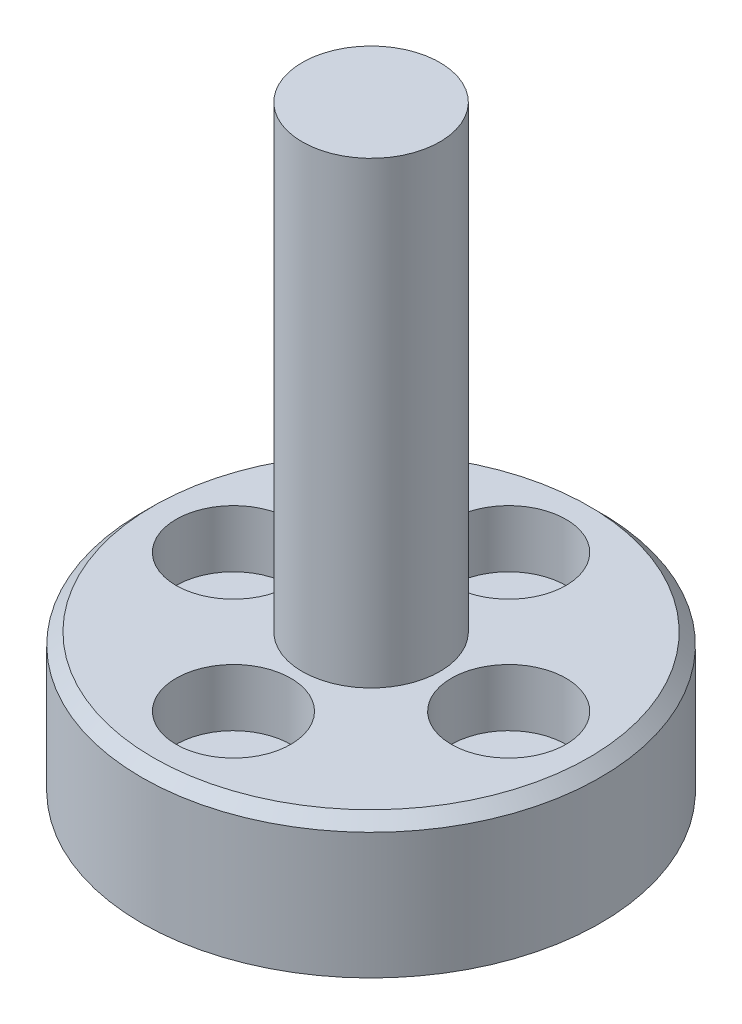
ISO-10303-21;
HEADER;
FILE_DESCRIPTION(('STEP AP214'),'2;1');
FILE_NAME('part.step','',(''),(''),'','','');
FILE_SCHEMA(('AUTOMOTIVE_DESIGN { 1 0 10303 214 1 1 1 1 }'));
ENDSEC;
DATA;
#1=APPLICATION_CONTEXT('core data for automotive mechanical design processes');
#2=APPLICATION_PROTOCOL_DEFINITION('international standard','automotive_design',2000,#1);
#3=PRODUCT_CONTEXT('',#1,'mechanical');
#4=PRODUCT('Part','Part','',(#3));
#5=PRODUCT_RELATED_PRODUCT_CATEGORY('part','',(#4));
#6=PRODUCT_DEFINITION_FORMATION('','',#4);
#7=PRODUCT_DEFINITION_CONTEXT('part definition',#1,'design');
#8=PRODUCT_DEFINITION('design','',#6,#7);
#9=PRODUCT_DEFINITION_SHAPE('','',#8);
#10=(LENGTH_UNIT() NAMED_UNIT(*) SI_UNIT(.MILLI.,.METRE.));
#11=(NAMED_UNIT(*) PLANE_ANGLE_UNIT() SI_UNIT($,.RADIAN.));
#12=(NAMED_UNIT(*) SI_UNIT($,.STERADIAN.) SOLID_ANGLE_UNIT());
#13=UNCERTAINTY_MEASURE_WITH_UNIT(LENGTH_MEASURE(1.E-05),#10,'distance_accuracy_value','');
#14=(GEOMETRIC_REPRESENTATION_CONTEXT(3) GLOBAL_UNCERTAINTY_ASSIGNED_CONTEXT((#13)) GLOBAL_UNIT_ASSIGNED_CONTEXT((#10,
#11,#12)) REPRESENTATION_CONTEXT('',''));
#15=CARTESIAN_POINT('',(0.,0.,0.));
#16=DIRECTION('',(0.,0.,1.));
#17=DIRECTION('',(1.,0.,0.));
#18=AXIS2_PLACEMENT_3D('',#15,#16,#17);
#19=CARTESIAN_POINT('',(-5.99999999999983,-4.,1.7016286254268E-13));
#20=DIRECTION('',(0.,1.,0.));
#21=DIRECTION('',(0.,0.,1.));
#22=AXIS2_PLACEMENT_3D('',#19,#20,#21);
#23=CYLINDRICAL_SURFACE('',#22,1.00000000000027);
#24=CARTESIAN_POINT('',(-5.99999999999983,0.,1.7016286254268E-13));
#25=DIRECTION('',(0.,1.,0.));
#26=DIRECTION('',(0.,0.,1.));
#27=AXIS2_PLACEMENT_3D('',#24,#25,#26);
#28=CIRCLE('',#27,1.00000000000027);
#29=CARTESIAN_POINT('',(-5.99999999999983,0.,1.00000000000044));
#30=VERTEX_POINT('',#29);
#31=EDGE_CURVE('E56',#30,#30,#28,.T.);
#32=ORIENTED_EDGE('',*,*,#31,.F.);
#33=EDGE_LOOP('',(#32));
#34=FACE_BOUND('',#33,.T.);
#35=CARTESIAN_POINT('',(-5.99999999999983,3.5,1.7016286254268E-13));
#36=DIRECTION('',(0.,1.,0.));
#37=DIRECTION('',(0.,0.,1.));
#38=AXIS2_PLACEMENT_3D('',#35,#36,#37);
#39=CIRCLE('',#38,1.00000000000027);
#40=CARTESIAN_POINT('',(-5.99999999999983,3.5,1.00000000000044));
#41=VERTEX_POINT('',#40);
#42=EDGE_CURVE('E41',#41,#41,#39,.F.);
#43=ORIENTED_EDGE('',*,*,#42,.F.);
#44=EDGE_LOOP('',(#43));
#45=FACE_BOUND('',#44,.T.);
#46=ADVANCED_FACE('F37',(#34,#45),#23,.F.);
#47=CARTESIAN_POINT('',(3.38856148926383E-13,-4.,6.));
#48=DIRECTION('',(0.,1.,0.));
#49=DIRECTION('',(0.,0.,1.));
#50=AXIS2_PLACEMENT_3D('',#47,#48,#49);
#51=CYLINDRICAL_SURFACE('',#50,1.00000000000036);
#52=CARTESIAN_POINT('',(3.38856148926383E-13,0.,6.));
#53=DIRECTION('',(0.,1.,0.));
#54=DIRECTION('',(0.,0.,1.));
#55=AXIS2_PLACEMENT_3D('',#52,#53,#54);
#56=CIRCLE('',#55,1.00000000000036);
#57=CARTESIAN_POINT('',(3.38856148926383E-13,0.,7.00000000000036));
#58=VERTEX_POINT('',#57);
#59=EDGE_CURVE('E60',#58,#58,#56,.T.);
#60=ORIENTED_EDGE('',*,*,#59,.F.);
#61=EDGE_LOOP('',(#60));
#62=FACE_BOUND('',#61,.T.);
#63=CARTESIAN_POINT('',(3.38856148926383E-13,3.5,6.));
#64=DIRECTION('',(0.,1.,0.));
#65=DIRECTION('',(0.,0.,1.));
#66=AXIS2_PLACEMENT_3D('',#63,#64,#65);
#67=CIRCLE('',#66,1.00000000000036);
#68=CARTESIAN_POINT('',(3.38856148926383E-13,3.5,7.00000000000036));
#69=VERTEX_POINT('',#68);
#70=EDGE_CURVE('E81',#69,#69,#67,.F.);
#71=ORIENTED_EDGE('',*,*,#70,.F.);
#72=EDGE_LOOP('',(#71));
#73=FACE_BOUND('',#72,.T.);
#74=ADVANCED_FACE('F93',(#62,#73),#51,.F.);
#75=CARTESIAN_POINT('',(6.00000000000017,-4.,-1.69428074463191E-13));
#76=DIRECTION('',(0.,1.,0.));
#77=DIRECTION('',(0.,0.,1.));
#78=AXIS2_PLACEMENT_3D('',#75,#76,#77);
#79=CYLINDRICAL_SURFACE('',#78,1.00000000000013);
#80=CARTESIAN_POINT('',(6.00000000000017,0.,-1.69428074463191E-13));
#81=DIRECTION('',(0.,1.,0.));
#82=DIRECTION('',(0.,0.,1.));
#83=AXIS2_PLACEMENT_3D('',#80,#81,#82);
#84=CIRCLE('',#83,1.00000000000013);
#85=CARTESIAN_POINT('',(6.00000000000017,0.,0.999999999999963));
#86=VERTEX_POINT('',#85);
#87=EDGE_CURVE('E64',#86,#86,#84,.T.);
#88=ORIENTED_EDGE('',*,*,#87,.F.);
#89=EDGE_LOOP('',(#88));
#90=FACE_BOUND('',#89,.T.);
#91=CARTESIAN_POINT('',(6.00000000000017,3.5,-1.69428074463191E-13));
#92=DIRECTION('',(0.,1.,0.));
#93=DIRECTION('',(0.,0.,1.));
#94=AXIS2_PLACEMENT_3D('',#91,#92,#93);
#95=CIRCLE('',#94,1.00000000000013);
#96=CARTESIAN_POINT('',(6.00000000000017,3.5,0.999999999999963));
#97=VERTEX_POINT('',#96);
#98=EDGE_CURVE('E77',#97,#97,#95,.F.);
#99=ORIENTED_EDGE('',*,*,#98,.F.);
#100=EDGE_LOOP('',(#99));
#101=FACE_BOUND('',#100,.T.);
#102=ADVANCED_FACE('F99',(#90,#101),#79,.F.);
#103=CARTESIAN_POINT('',(0.,-4.,-6.));
#104=DIRECTION('',(0.,1.,0.));
#105=DIRECTION('',(0.,0.,1.));
#106=AXIS2_PLACEMENT_3D('',#103,#104,#105);
#107=CYLINDRICAL_SURFACE('',#106,1.);
#108=CARTESIAN_POINT('',(0.,0.,-6.));
#109=DIRECTION('',(0.,1.,0.));
#110=DIRECTION('',(0.,0.,1.));
#111=AXIS2_PLACEMENT_3D('',#108,#109,#110);
#112=CIRCLE('',#111,1.);
#113=CARTESIAN_POINT('',(0.,0.,-5.));
#114=VERTEX_POINT('',#113);
#115=EDGE_CURVE('E68',#114,#114,#112,.T.);
#116=ORIENTED_EDGE('',*,*,#115,.F.);
#117=EDGE_LOOP('',(#116));
#118=FACE_BOUND('',#117,.T.);
#119=CARTESIAN_POINT('',(0.,3.5,-6.));
#120=DIRECTION('',(0.,1.,0.));
#121=DIRECTION('',(0.,0.,1.));
#122=AXIS2_PLACEMENT_3D('',#119,#120,#121);
#123=CIRCLE('',#122,1.);
#124=CARTESIAN_POINT('',(0.,3.5,-5.));
#125=VERTEX_POINT('',#124);
#126=EDGE_CURVE('E73',#125,#125,#123,.F.);
#127=ORIENTED_EDGE('',*,*,#126,.F.);
#128=EDGE_LOOP('',(#127));
#129=FACE_BOUND('',#128,.T.);
#130=ADVANCED_FACE('F135',(#118,#129),#107,.F.);
#131=CARTESIAN_POINT('',(0.,26.,0.));
#132=DIRECTION('',(0.,-1.,0.));
#133=DIRECTION('',(0.,0.,-1.));
#134=AXIS2_PLACEMENT_3D('',#131,#132,#133);
#135=PLANE('',#134);
#136=CARTESIAN_POINT('',(0.,26.,0.));
#137=DIRECTION('',(0.,1.,0.));
#138=DIRECTION('',(0.,0.,1.));
#139=AXIS2_PLACEMENT_3D('',#136,#137,#138);
#140=CIRCLE('',#139,3.);
#141=CARTESIAN_POINT('',(0.,26.,3.));
#142=VERTEX_POINT('',#141);
#143=EDGE_CURVE('E10',#142,#142,#140,.T.);
#144=ORIENTED_EDGE('',*,*,#143,.T.);
#145=EDGE_LOOP('',(#144));
#146=FACE_BOUND('',#145,.T.);
#147=ADVANCED_FACE('F39',(#146),#135,.F.);
#148=CARTESIAN_POINT('',(0.,9.94731790341664,0.));
#149=DIRECTION('',(0.,1.,0.));
#150=DIRECTION('',(0.,0.,1.));
#151=AXIS2_PLACEMENT_3D('',#148,#149,#150);
#152=CYLINDRICAL_SURFACE('',#151,3.);
#153=ORIENTED_EDGE('',*,*,#143,.F.);
#154=EDGE_LOOP('',(#153));
#155=FACE_BOUND('',#154,.T.);
#156=CARTESIAN_POINT('',(0.,6.,0.));
#157=DIRECTION('',(0.,1.,0.));
#158=DIRECTION('',(0.,0.,1.));
#159=AXIS2_PLACEMENT_3D('',#156,#157,#158);
#160=CIRCLE('',#159,3.);
#161=CARTESIAN_POINT('',(0.,6.,3.));
#162=VERTEX_POINT('',#161);
#163=EDGE_CURVE('E46',#162,#162,#160,.T.);
#164=ORIENTED_EDGE('',*,*,#163,.T.);
#165=EDGE_LOOP('',(#164));
#166=FACE_BOUND('',#165,.T.);
#167=ADVANCED_FACE('F128',(#155,#166),#152,.T.);
#168=CARTESIAN_POINT('',(3.,6.,0.));
#169=DIRECTION('',(0.,-1.,0.));
#170=DIRECTION('',(0.,0.,-1.));
#171=AXIS2_PLACEMENT_3D('',#168,#169,#170);
#172=PLANE('',#171);
#173=CARTESIAN_POINT('',(0.,6.,-6.));
#174=DIRECTION('',(0.,1.,0.));
#175=DIRECTION('',(0.,0.,1.));
#176=AXIS2_PLACEMENT_3D('',#173,#174,#175);
#177=CIRCLE('',#176,2.5);
#178=CARTESIAN_POINT('',(0.,6.,-3.5));
#179=VERTEX_POINT('',#178);
#180=EDGE_CURVE('E183',#179,#179,#177,.T.);
#181=ORIENTED_EDGE('',*,*,#180,.F.);
#182=EDGE_LOOP('',(#181));
#183=FACE_BOUND('',#182,.T.);
#184=CARTESIAN_POINT('',(6.00000000000017,6.,-1.69428074463191E-13));
#185=DIRECTION('',(0.,1.,0.));
#186=DIRECTION('',(0.,0.,1.));
#187=AXIS2_PLACEMENT_3D('',#184,#185,#186);
#188=CIRCLE('',#187,2.50000000000013);
#189=CARTESIAN_POINT('',(6.00000000000017,6.,2.49999999999996));
#190=VERTEX_POINT('',#189);
#191=EDGE_CURVE('E175',#190,#190,#188,.T.);
#192=ORIENTED_EDGE('',*,*,#191,.F.);
#193=EDGE_LOOP('',(#192));
#194=FACE_BOUND('',#193,.T.);
#195=CARTESIAN_POINT('',(3.38856148926383E-13,6.,6.));
#196=DIRECTION('',(0.,1.,0.));
#197=DIRECTION('',(0.,0.,1.));
#198=AXIS2_PLACEMENT_3D('',#195,#196,#197);
#199=CIRCLE('',#198,2.50000000000036);
#200=CARTESIAN_POINT('',(3.38856148926383E-13,6.,8.50000000000036));
#201=VERTEX_POINT('',#200);
#202=EDGE_CURVE('E167',#201,#201,#199,.T.);
#203=ORIENTED_EDGE('',*,*,#202,.F.);
#204=EDGE_LOOP('',(#203));
#205=FACE_BOUND('',#204,.T.);
#206=CARTESIAN_POINT('',(-5.99999999999983,6.,1.7016286254268E-13));
#207=DIRECTION('',(0.,1.,0.));
#208=DIRECTION('',(0.,0.,1.));
#209=AXIS2_PLACEMENT_3D('',#206,#207,#208);
#210=CIRCLE('',#209,2.50000000000027);
#211=CARTESIAN_POINT('',(-5.99999999999983,6.,2.50000000000044));
#212=VERTEX_POINT('',#211);
#213=EDGE_CURVE('E159',#212,#212,#210,.T.);
#214=ORIENTED_EDGE('',*,*,#213,.F.);
#215=EDGE_LOOP('',(#214));
#216=FACE_BOUND('',#215,.T.);
#217=ORIENTED_EDGE('',*,*,#163,.F.);
#218=EDGE_LOOP('',(#217));
#219=FACE_BOUND('',#218,.T.);
#220=CARTESIAN_POINT('',(0.,6.,0.));
#221=DIRECTION('',(0.,1.,0.));
#222=DIRECTION('',(0.,0.,1.));
#223=AXIS2_PLACEMENT_3D('',#220,#221,#222);
#224=CIRCLE('',#223,9.5);
#225=CARTESIAN_POINT('',(0.,6.,9.5));
#226=VERTEX_POINT('',#225);
#227=EDGE_CURVE('E52',#226,#226,#224,.T.);
#228=ORIENTED_EDGE('',*,*,#227,.T.);
#229=EDGE_LOOP('',(#228));
#230=FACE_BOUND('',#229,.T.);
#231=ADVANCED_FACE('F125',(#183,#194,#205,#216,#219,#230),#172,.F.);
#232=CARTESIAN_POINT('',(0.,5.5,0.));
#233=DIRECTION('',(0.,-1.,0.));
#234=DIRECTION('',(0.,0.,-1.));
#235=AXIS2_PLACEMENT_3D('',#232,#233,#234);
#236=CONICAL_SURFACE('',#235,10.,0.785398163397451);
#237=ORIENTED_EDGE('',*,*,#227,.F.);
#238=EDGE_LOOP('',(#237));
#239=FACE_BOUND('',#238,.T.);
#240=CARTESIAN_POINT('',(0.,5.5,0.));
#241=DIRECTION('',(0.,1.,0.));
#242=DIRECTION('',(0.,0.,1.));
#243=AXIS2_PLACEMENT_3D('',#240,#241,#242);
#244=CIRCLE('',#243,10.);
#245=CARTESIAN_POINT('',(0.,5.5,10.));
#246=VERTEX_POINT('',#245);
#247=EDGE_CURVE('E143',#246,#246,#244,.T.);
#248=ORIENTED_EDGE('',*,*,#247,.T.);
#249=EDGE_LOOP('',(#248));
#250=FACE_BOUND('',#249,.T.);
#251=ADVANCED_FACE('F121',(#239,#250),#236,.T.);
#252=CARTESIAN_POINT('',(0.,9.94731790341664,0.));
#253=DIRECTION('',(0.,1.,0.));
#254=DIRECTION('',(0.,0.,1.));
#255=AXIS2_PLACEMENT_3D('',#252,#253,#254);
#256=CYLINDRICAL_SURFACE('',#255,10.);
#257=ORIENTED_EDGE('',*,*,#247,.F.);
#258=EDGE_LOOP('',(#257));
#259=FACE_BOUND('',#258,.T.);
#260=CARTESIAN_POINT('',(0.,0.,0.));
#261=DIRECTION('',(0.,1.,0.));
#262=DIRECTION('',(0.,0.,1.));
#263=AXIS2_PLACEMENT_3D('',#260,#261,#262);
#264=CIRCLE('',#263,10.);
#265=CARTESIAN_POINT('',(0.,0.,10.));
#266=VERTEX_POINT('',#265);
#267=EDGE_CURVE('E146',#266,#266,#264,.T.);
#268=ORIENTED_EDGE('',*,*,#267,.T.);
#269=EDGE_LOOP('',(#268));
#270=FACE_BOUND('',#269,.T.);
#271=ADVANCED_FACE('F117',(#259,#270),#256,.T.);
#272=CARTESIAN_POINT('',(10.,0.,0.));
#273=DIRECTION('',(0.,1.,0.));
#274=DIRECTION('',(0.,0.,1.));
#275=AXIS2_PLACEMENT_3D('',#272,#273,#274);
#276=PLANE('',#275);
#277=ORIENTED_EDGE('',*,*,#115,.T.);
#278=EDGE_LOOP('',(#277));
#279=FACE_BOUND('',#278,.T.);
#280=ORIENTED_EDGE('',*,*,#87,.T.);
#281=EDGE_LOOP('',(#280));
#282=FACE_BOUND('',#281,.T.);
#283=ORIENTED_EDGE('',*,*,#59,.T.);
#284=EDGE_LOOP('',(#283));
#285=FACE_BOUND('',#284,.T.);
#286=ORIENTED_EDGE('',*,*,#31,.T.);
#287=EDGE_LOOP('',(#286));
#288=FACE_BOUND('',#287,.T.);
#289=ORIENTED_EDGE('',*,*,#267,.F.);
#290=EDGE_LOOP('',(#289));
#291=FACE_BOUND('',#290,.T.);
#292=CARTESIAN_POINT('',(0.,0.,0.));
#293=DIRECTION('',(0.,1.,0.));
#294=DIRECTION('',(0.,0.,1.));
#295=AXIS2_PLACEMENT_3D('',#292,#293,#294);
#296=CIRCLE('',#295,3.);
#297=CARTESIAN_POINT('',(0.,0.,3.));
#298=VERTEX_POINT('',#297);
#299=EDGE_CURVE('E152',#298,#298,#296,.T.);
#300=ORIENTED_EDGE('',*,*,#299,.T.);
#301=EDGE_LOOP('',(#300));
#302=FACE_BOUND('',#301,.T.);
#303=ADVANCED_FACE('F113',(#279,#282,#285,#288,#291,#302),#276,.F.);
#304=CARTESIAN_POINT('',(0.,9.94731790341664,0.));
#305=DIRECTION('',(0.,1.,0.));
#306=DIRECTION('',(0.,0.,1.));
#307=AXIS2_PLACEMENT_3D('',#304,#305,#306);
#308=CYLINDRICAL_SURFACE('',#307,3.);
#309=ORIENTED_EDGE('',*,*,#299,.F.);
#310=EDGE_LOOP('',(#309));
#311=FACE_BOUND('',#310,.T.);
#312=CARTESIAN_POINT('',(0.,3.,0.));
#313=DIRECTION('',(0.,1.,0.));
#314=DIRECTION('',(0.,0.,1.));
#315=AXIS2_PLACEMENT_3D('',#312,#313,#314);
#316=CIRCLE('',#315,3.);
#317=CARTESIAN_POINT('',(0.,3.,3.));
#318=VERTEX_POINT('',#317);
#319=EDGE_CURVE('E72',#318,#318,#316,.T.);
#320=ORIENTED_EDGE('',*,*,#319,.T.);
#321=EDGE_LOOP('',(#320));
#322=FACE_BOUND('',#321,.T.);
#323=ADVANCED_FACE('F109',(#311,#322),#308,.F.);
#324=CARTESIAN_POINT('',(3.,3.,0.));
#325=DIRECTION('',(0.,1.,0.));
#326=DIRECTION('',(0.,0.,1.));
#327=AXIS2_PLACEMENT_3D('',#324,#325,#326);
#328=PLANE('',#327);
#329=ORIENTED_EDGE('',*,*,#319,.F.);
#330=EDGE_LOOP('',(#329));
#331=FACE_BOUND('',#330,.T.);
#332=ADVANCED_FACE('F105',(#331),#328,.F.);
#333=CARTESIAN_POINT('',(0.,3.5,-6.));
#334=DIRECTION('',(0.,1.,0.));
#335=DIRECTION('',(0.,0.,1.));
#336=AXIS2_PLACEMENT_3D('',#333,#334,#335);
#337=PLANE('',#336);
#338=CARTESIAN_POINT('',(0.,3.5,-6.));
#339=DIRECTION('',(0.,1.,0.));
#340=DIRECTION('',(0.,0.,1.));
#341=AXIS2_PLACEMENT_3D('',#338,#339,#340);
#342=CIRCLE('',#341,2.5);
#343=CARTESIAN_POINT('',(0.,3.5,-3.5));
#344=VERTEX_POINT('',#343);
#345=EDGE_CURVE('E78',#344,#344,#342,.T.);
#346=ORIENTED_EDGE('',*,*,#345,.T.);
#347=EDGE_LOOP('',(#346));
#348=FACE_BOUND('',#347,.T.);
#349=ORIENTED_EDGE('',*,*,#126,.T.);
#350=EDGE_LOOP('',(#349));
#351=FACE_BOUND('',#350,.T.);
#352=ADVANCED_FACE('F108',(#348,#351),#337,.T.);
#353=CARTESIAN_POINT('',(0.,3.5,-6.));
#354=DIRECTION('',(0.,1.,0.));
#355=DIRECTION('',(0.,0.,1.));
#356=AXIS2_PLACEMENT_3D('',#353,#354,#355);
#357=CYLINDRICAL_SURFACE('',#356,2.5);
#358=ORIENTED_EDGE('',*,*,#345,.F.);
#359=EDGE_LOOP('',(#358));
#360=FACE_BOUND('',#359,.T.);
#361=ORIENTED_EDGE('',*,*,#180,.T.);
#362=EDGE_LOOP('',(#361));
#363=FACE_BOUND('',#362,.T.);
#364=ADVANCED_FACE('F193',(#360,#363),#357,.F.);
#365=CARTESIAN_POINT('',(6.00000000000017,3.5,-1.69428074463191E-13));
#366=DIRECTION('',(0.,1.,0.));
#367=DIRECTION('',(0.,0.,1.));
#368=AXIS2_PLACEMENT_3D('',#365,#366,#367);
#369=PLANE('',#368);
#370=CARTESIAN_POINT('',(6.00000000000017,3.5,-1.69428074463191E-13));
#371=DIRECTION('',(0.,1.,0.));
#372=DIRECTION('',(0.,0.,1.));
#373=AXIS2_PLACEMENT_3D('',#370,#371,#372);
#374=CIRCLE('',#373,2.50000000000013);
#375=CARTESIAN_POINT('',(6.00000000000017,3.5,2.49999999999996));
#376=VERTEX_POINT('',#375);
#377=EDGE_CURVE('E179',#376,#376,#374,.T.);
#378=ORIENTED_EDGE('',*,*,#377,.T.);
#379=EDGE_LOOP('',(#378));
#380=FACE_BOUND('',#379,.T.);
#381=ORIENTED_EDGE('',*,*,#98,.T.);
#382=EDGE_LOOP('',(#381));
#383=FACE_BOUND('',#382,.T.);
#384=ADVANCED_FACE('F196',(#380,#383),#369,.T.);
#385=CARTESIAN_POINT('',(6.00000000000017,3.5,-1.69428074463191E-13));
#386=DIRECTION('',(0.,1.,0.));
#387=DIRECTION('',(0.,0.,1.));
#388=AXIS2_PLACEMENT_3D('',#385,#386,#387);
#389=CYLINDRICAL_SURFACE('',#388,2.50000000000013);
#390=ORIENTED_EDGE('',*,*,#377,.F.);
#391=EDGE_LOOP('',(#390));
#392=FACE_BOUND('',#391,.T.);
#393=ORIENTED_EDGE('',*,*,#191,.T.);
#394=EDGE_LOOP('',(#393));
#395=FACE_BOUND('',#394,.T.);
#396=ADVANCED_FACE('F230',(#392,#395),#389,.F.);
#397=CARTESIAN_POINT('',(3.38856148926383E-13,3.5,6.));
#398=DIRECTION('',(0.,1.,0.));
#399=DIRECTION('',(0.,0.,1.));
#400=AXIS2_PLACEMENT_3D('',#397,#398,#399);
#401=PLANE('',#400);
#402=CARTESIAN_POINT('',(3.38856148926383E-13,3.5,6.));
#403=DIRECTION('',(0.,1.,0.));
#404=DIRECTION('',(0.,0.,1.));
#405=AXIS2_PLACEMENT_3D('',#402,#403,#404);
#406=CIRCLE('',#405,2.50000000000036);
#407=CARTESIAN_POINT('',(3.38856148926383E-13,3.5,8.50000000000036));
#408=VERTEX_POINT('',#407);
#409=EDGE_CURVE('E171',#408,#408,#406,.T.);
#410=ORIENTED_EDGE('',*,*,#409,.T.);
#411=EDGE_LOOP('',(#410));
#412=FACE_BOUND('',#411,.T.);
#413=ORIENTED_EDGE('',*,*,#70,.T.);
#414=EDGE_LOOP('',(#413));
#415=FACE_BOUND('',#414,.T.);
#416=ADVANCED_FACE('F236',(#412,#415),#401,.T.);
#417=CARTESIAN_POINT('',(3.38856148926383E-13,3.5,6.));
#418=DIRECTION('',(0.,1.,0.));
#419=DIRECTION('',(0.,0.,1.));
#420=AXIS2_PLACEMENT_3D('',#417,#418,#419);
#421=CYLINDRICAL_SURFACE('',#420,2.50000000000036);
#422=ORIENTED_EDGE('',*,*,#409,.F.);
#423=EDGE_LOOP('',(#422));
#424=FACE_BOUND('',#423,.T.);
#425=ORIENTED_EDGE('',*,*,#202,.T.);
#426=EDGE_LOOP('',(#425));
#427=FACE_BOUND('',#426,.T.);
#428=ADVANCED_FACE('F213',(#424,#427),#421,.F.);
#429=CARTESIAN_POINT('',(-5.99999999999983,3.5,1.7016286254268E-13));
#430=DIRECTION('',(0.,1.,0.));
#431=DIRECTION('',(0.,0.,1.));
#432=AXIS2_PLACEMENT_3D('',#429,#430,#431);
#433=PLANE('',#432);
#434=CARTESIAN_POINT('',(-5.99999999999983,3.5,1.7016286254268E-13));
#435=DIRECTION('',(0.,1.,0.));
#436=DIRECTION('',(0.,0.,1.));
#437=AXIS2_PLACEMENT_3D('',#434,#435,#436);
#438=CIRCLE('',#437,2.50000000000027);
#439=CARTESIAN_POINT('',(-5.99999999999983,3.5,2.50000000000044));
#440=VERTEX_POINT('',#439);
#441=EDGE_CURVE('E163',#440,#440,#438,.T.);
#442=ORIENTED_EDGE('',*,*,#441,.T.);
#443=EDGE_LOOP('',(#442));
#444=FACE_BOUND('',#443,.T.);
#445=ORIENTED_EDGE('',*,*,#42,.T.);
#446=EDGE_LOOP('',(#445));
#447=FACE_BOUND('',#446,.T.);
#448=ADVANCED_FACE('F90',(#444,#447),#433,.T.);
#449=CARTESIAN_POINT('',(-5.99999999999983,3.5,1.7016286254268E-13));
#450=DIRECTION('',(0.,1.,0.));
#451=DIRECTION('',(0.,0.,1.));
#452=AXIS2_PLACEMENT_3D('',#449,#450,#451);
#453=CYLINDRICAL_SURFACE('',#452,2.50000000000027);
#454=ORIENTED_EDGE('',*,*,#441,.F.);
#455=EDGE_LOOP('',(#454));
#456=FACE_BOUND('',#455,.T.);
#457=ORIENTED_EDGE('',*,*,#213,.T.);
#458=EDGE_LOOP('',(#457));
#459=FACE_BOUND('',#458,.T.);
#460=ADVANCED_FACE('F206',(#456,#459),#453,.F.);
#461=CLOSED_SHELL('',(#46,#74,#102,#130,#147,#167,#231,#251,#271,#303,#323,#332,#352,#364,#384,
#396,#416,#428,#448,#460));
#462=MANIFOLD_SOLID_BREP('B2',#461);
#463=ADVANCED_BREP_SHAPE_REPRESENTATION('',(#18,#462),#14);
#464=SHAPE_DEFINITION_REPRESENTATION(#9,#463);
ENDSEC;
END-ISO-10303-21;
